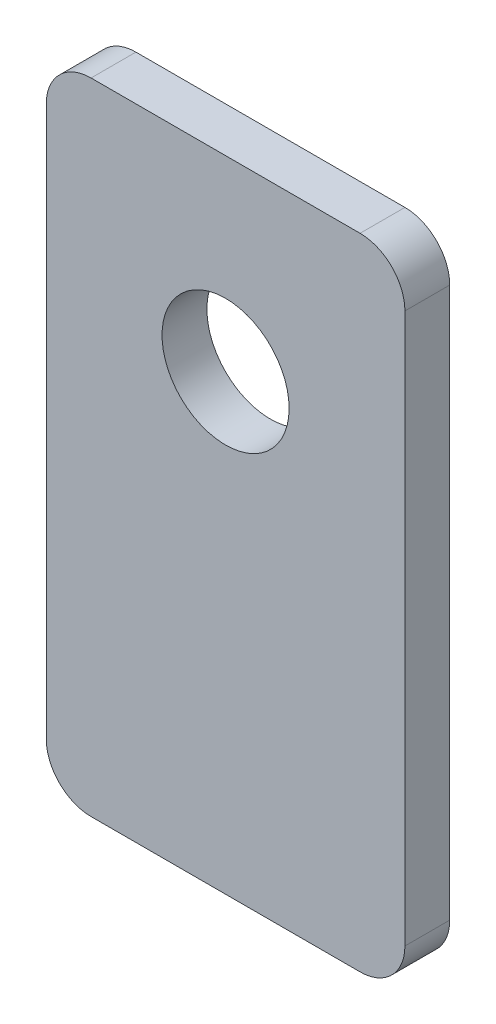
ISO-10303-21;
HEADER;
FILE_DESCRIPTION(('STEP AP214'),'2;1');
FILE_NAME('part.step','',(''),(''),'','','');
FILE_SCHEMA(('AUTOMOTIVE_DESIGN { 1 0 10303 214 1 1 1 1 }'));
ENDSEC;
DATA;
#1=APPLICATION_CONTEXT('core data for automotive mechanical design processes');
#2=APPLICATION_PROTOCOL_DEFINITION('international standard','automotive_design',2000,#1);
#3=PRODUCT_CONTEXT('',#1,'mechanical');
#4=PRODUCT('Part','Part','',(#3));
#5=PRODUCT_RELATED_PRODUCT_CATEGORY('part','',(#4));
#6=PRODUCT_DEFINITION_FORMATION('','',#4);
#7=PRODUCT_DEFINITION_CONTEXT('part definition',#1,'design');
#8=PRODUCT_DEFINITION('design','',#6,#7);
#9=PRODUCT_DEFINITION_SHAPE('','',#8);
#10=(LENGTH_UNIT() NAMED_UNIT(*) SI_UNIT(.MILLI.,.METRE.));
#11=(NAMED_UNIT(*) PLANE_ANGLE_UNIT() SI_UNIT($,.RADIAN.));
#12=(NAMED_UNIT(*) SI_UNIT($,.STERADIAN.) SOLID_ANGLE_UNIT());
#13=UNCERTAINTY_MEASURE_WITH_UNIT(LENGTH_MEASURE(1.E-05),#10,'distance_accuracy_value','');
#14=(GEOMETRIC_REPRESENTATION_CONTEXT(3) GLOBAL_UNCERTAINTY_ASSIGNED_CONTEXT((#13)) GLOBAL_UNIT_ASSIGNED_CONTEXT((#10,
#11,#12)) REPRESENTATION_CONTEXT('',''));
#15=CARTESIAN_POINT('',(0.,0.,0.));
#16=DIRECTION('',(0.,0.,1.));
#17=DIRECTION('',(1.,0.,0.));
#18=AXIS2_PLACEMENT_3D('',#15,#16,#17);
#19=CARTESIAN_POINT('',(12.7,-22.65,3.175));
#20=DIRECTION('',(-1.,0.,0.));
#21=DIRECTION('',(0.,0.,1.));
#22=AXIS2_PLACEMENT_3D('',#19,#20,#21);
#23=PLANE('',#22);
#24=DIRECTION('',(0.,1.,0.));
#25=VECTOR('',#24,1.);
#26=CARTESIAN_POINT('',(12.7,-22.65,3.175));
#27=LINE('',#26,#25);
#28=CARTESIAN_POINT('',(12.7,-19.475,3.175));
#29=VERTEX_POINT('',#28);
#30=CARTESIAN_POINT('',(12.7,19.475,3.175));
#31=VERTEX_POINT('',#30);
#32=EDGE_CURVE('E144',#29,#31,#27,.T.);
#33=ORIENTED_EDGE('',*,*,#32,.F.);
#34=DIRECTION('',(0.,0.,-1.));
#35=VECTOR('',#34,1.);
#36=CARTESIAN_POINT('',(12.7,-19.475,3.175));
#37=LINE('',#36,#35);
#38=CARTESIAN_POINT('',(12.7,-19.475,0.));
#39=VERTEX_POINT('',#38);
#40=EDGE_CURVE('E11',#29,#39,#37,.T.);
#41=ORIENTED_EDGE('',*,*,#40,.T.);
#42=DIRECTION('',(0.,1.,0.));
#43=VECTOR('',#42,1.);
#44=CARTESIAN_POINT('',(12.7,-22.65,0.));
#45=LINE('',#44,#43);
#46=CARTESIAN_POINT('',(12.7,19.475,0.));
#47=VERTEX_POINT('',#46);
#48=EDGE_CURVE('E146',#39,#47,#45,.T.);
#49=ORIENTED_EDGE('',*,*,#48,.T.);
#50=DIRECTION('',(0.,0.,-1.));
#51=VECTOR('',#50,1.);
#52=CARTESIAN_POINT('',(12.7,19.475,3.175));
#53=LINE('',#52,#51);
#54=EDGE_CURVE('E52',#47,#31,#53,.F.);
#55=ORIENTED_EDGE('',*,*,#54,.T.);
#56=EDGE_LOOP('',(#33,#41,#49,#55));
#57=FACE_BOUND('',#56,.T.);
#58=ADVANCED_FACE('F43',(#57),#23,.F.);
#59=CARTESIAN_POINT('',(-12.7,22.65,3.175));
#60=DIRECTION('',(0.,-1.,0.));
#61=DIRECTION('',(0.,0.,-1.));
#62=AXIS2_PLACEMENT_3D('',#59,#60,#61);
#63=PLANE('',#62);
#64=DIRECTION('',(-1.,0.,0.));
#65=VECTOR('',#64,1.);
#66=CARTESIAN_POINT('',(-12.7,22.65,0.));
#67=LINE('',#66,#65);
#68=CARTESIAN_POINT('',(9.525,22.65,0.));
#69=VERTEX_POINT('',#68);
#70=CARTESIAN_POINT('',(-9.525,22.65,0.));
#71=VERTEX_POINT('',#70);
#72=EDGE_CURVE('E140',#69,#71,#67,.T.);
#73=ORIENTED_EDGE('',*,*,#72,.T.);
#74=DIRECTION('',(0.,0.,-1.));
#75=VECTOR('',#74,1.);
#76=CARTESIAN_POINT('',(-9.525,22.65,3.175));
#77=LINE('',#76,#75);
#78=CARTESIAN_POINT('',(-9.525,22.65,3.175));
#79=VERTEX_POINT('',#78);
#80=EDGE_CURVE('E116',#71,#79,#77,.F.);
#81=ORIENTED_EDGE('',*,*,#80,.T.);
#82=DIRECTION('',(-1.,0.,0.));
#83=VECTOR('',#82,1.);
#84=CARTESIAN_POINT('',(-12.7,22.65,3.175));
#85=LINE('',#84,#83);
#86=CARTESIAN_POINT('',(9.525,22.65,3.175));
#87=VERTEX_POINT('',#86);
#88=EDGE_CURVE('E196',#87,#79,#85,.T.);
#89=ORIENTED_EDGE('',*,*,#88,.F.);
#90=DIRECTION('',(0.,0.,-1.));
#91=VECTOR('',#90,1.);
#92=CARTESIAN_POINT('',(9.525,22.65,3.175));
#93=LINE('',#92,#91);
#94=EDGE_CURVE('E122',#87,#69,#93,.T.);
#95=ORIENTED_EDGE('',*,*,#94,.T.);
#96=EDGE_LOOP('',(#73,#81,#89,#95));
#97=FACE_BOUND('',#96,.T.);
#98=ADVANCED_FACE('F200',(#97),#63,.F.);
#99=CARTESIAN_POINT('',(-12.7,-22.65,3.175));
#100=DIRECTION('',(1.,0.,0.));
#101=DIRECTION('',(0.,0.,-1.));
#102=AXIS2_PLACEMENT_3D('',#99,#100,#101);
#103=PLANE('',#102);
#104=DIRECTION('',(0.,-1.,0.));
#105=VECTOR('',#104,1.);
#106=CARTESIAN_POINT('',(-12.7,-22.65,3.175));
#107=LINE('',#106,#105);
#108=CARTESIAN_POINT('',(-12.7,19.475,3.175));
#109=VERTEX_POINT('',#108);
#110=CARTESIAN_POINT('',(-12.7,-19.475,3.175));
#111=VERTEX_POINT('',#110);
#112=EDGE_CURVE('E131',#109,#111,#107,.T.);
#113=ORIENTED_EDGE('',*,*,#112,.F.);
#114=DIRECTION('',(0.,0.,-1.));
#115=VECTOR('',#114,1.);
#116=CARTESIAN_POINT('',(-12.7,19.475,3.175));
#117=LINE('',#116,#115);
#118=CARTESIAN_POINT('',(-12.7,19.475,0.));
#119=VERTEX_POINT('',#118);
#120=EDGE_CURVE('E115',#109,#119,#117,.T.);
#121=ORIENTED_EDGE('',*,*,#120,.T.);
#122=DIRECTION('',(0.,-1.,0.));
#123=VECTOR('',#122,1.);
#124=CARTESIAN_POINT('',(-12.7,-22.65,0.));
#125=LINE('',#124,#123);
#126=CARTESIAN_POINT('',(-12.7,-19.475,0.));
#127=VERTEX_POINT('',#126);
#128=EDGE_CURVE('E129',#119,#127,#125,.T.);
#129=ORIENTED_EDGE('',*,*,#128,.T.);
#130=DIRECTION('',(0.,0.,-1.));
#131=VECTOR('',#130,1.);
#132=CARTESIAN_POINT('',(-12.7,-19.475,3.175));
#133=LINE('',#132,#131);
#134=EDGE_CURVE('E134',#127,#111,#133,.F.);
#135=ORIENTED_EDGE('',*,*,#134,.T.);
#136=EDGE_LOOP('',(#113,#121,#129,#135));
#137=FACE_BOUND('',#136,.T.);
#138=ADVANCED_FACE('F128',(#137),#103,.F.);
#139=CARTESIAN_POINT('',(-12.7,-22.65,3.175));
#140=DIRECTION('',(0.,1.,0.));
#141=DIRECTION('',(0.,0.,1.));
#142=AXIS2_PLACEMENT_3D('',#139,#140,#141);
#143=PLANE('',#142);
#144=DIRECTION('',(1.,0.,0.));
#145=VECTOR('',#144,1.);
#146=CARTESIAN_POINT('',(-12.7,-22.65,3.175));
#147=LINE('',#146,#145);
#148=CARTESIAN_POINT('',(-9.525,-22.65,3.175));
#149=VERTEX_POINT('',#148);
#150=CARTESIAN_POINT('',(9.525,-22.65,3.175));
#151=VERTEX_POINT('',#150);
#152=EDGE_CURVE('E151',#149,#151,#147,.T.);
#153=ORIENTED_EDGE('',*,*,#152,.F.);
#154=DIRECTION('',(0.,0.,-1.));
#155=VECTOR('',#154,1.);
#156=CARTESIAN_POINT('',(-9.525,-22.65,3.175));
#157=LINE('',#156,#155);
#158=CARTESIAN_POINT('',(-9.525,-22.65,0.));
#159=VERTEX_POINT('',#158);
#160=EDGE_CURVE('E178',#149,#159,#157,.T.);
#161=ORIENTED_EDGE('',*,*,#160,.T.);
#162=DIRECTION('',(1.,0.,0.));
#163=VECTOR('',#162,1.);
#164=CARTESIAN_POINT('',(-12.7,-22.65,0.));
#165=LINE('',#164,#163);
#166=CARTESIAN_POINT('',(9.525,-22.65,0.));
#167=VERTEX_POINT('',#166);
#168=EDGE_CURVE('E139',#159,#167,#165,.T.);
#169=ORIENTED_EDGE('',*,*,#168,.T.);
#170=DIRECTION('',(0.,0.,-1.));
#171=VECTOR('',#170,1.);
#172=CARTESIAN_POINT('',(9.525,-22.65,3.175));
#173=LINE('',#172,#171);
#174=EDGE_CURVE('E59',#167,#151,#173,.F.);
#175=ORIENTED_EDGE('',*,*,#174,.T.);
#176=EDGE_LOOP('',(#153,#161,#169,#175));
#177=FACE_BOUND('',#176,.T.);
#178=ADVANCED_FACE('F221',(#177),#143,.F.);
#179=CARTESIAN_POINT('',(0.,0.,3.175));
#180=DIRECTION('',(0.,0.,-1.));
#181=DIRECTION('',(-1.,0.,0.));
#182=AXIS2_PLACEMENT_3D('',#179,#180,#181);
#183=PLANE('',#182);
#184=CARTESIAN_POINT('',(0.,9.40000000000001,3.175));
#185=DIRECTION('',(0.,0.,1.));
#186=DIRECTION('',(1.,0.,0.));
#187=AXIS2_PLACEMENT_3D('',#184,#185,#186);
#188=CIRCLE('',#187,4.5);
#189=CARTESIAN_POINT('',(4.5,9.40000000000001,3.175));
#190=VERTEX_POINT('',#189);
#191=EDGE_CURVE('E205',#190,#190,#188,.T.);
#192=ORIENTED_EDGE('',*,*,#191,.F.);
#193=EDGE_LOOP('',(#192));
#194=FACE_BOUND('',#193,.T.);
#195=ORIENTED_EDGE('',*,*,#88,.T.);
#196=CARTESIAN_POINT('',(-9.525,19.475,3.175));
#197=DIRECTION('',(0.,0.,-1.));
#198=DIRECTION('',(-1.,0.,0.));
#199=AXIS2_PLACEMENT_3D('',#196,#197,#198);
#200=CIRCLE('',#199,3.175);
#201=EDGE_CURVE('E173',#79,#109,#200,.F.);
#202=ORIENTED_EDGE('',*,*,#201,.T.);
#203=ORIENTED_EDGE('',*,*,#112,.T.);
#204=CARTESIAN_POINT('',(-9.525,-19.475,3.175));
#205=DIRECTION('',(0.,0.,-1.));
#206=DIRECTION('',(-1.,0.,0.));
#207=AXIS2_PLACEMENT_3D('',#204,#205,#206);
#208=CIRCLE('',#207,3.175);
#209=EDGE_CURVE('E66',#111,#149,#208,.F.);
#210=ORIENTED_EDGE('',*,*,#209,.T.);
#211=ORIENTED_EDGE('',*,*,#152,.T.);
#212=CARTESIAN_POINT('',(9.525,-19.475,3.175));
#213=DIRECTION('',(0.,0.,-1.));
#214=DIRECTION('',(-1.,0.,0.));
#215=AXIS2_PLACEMENT_3D('',#212,#213,#214);
#216=CIRCLE('',#215,3.175);
#217=EDGE_CURVE('E168',#151,#29,#216,.F.);
#218=ORIENTED_EDGE('',*,*,#217,.T.);
#219=ORIENTED_EDGE('',*,*,#32,.T.);
#220=CARTESIAN_POINT('',(9.525,19.475,3.175));
#221=DIRECTION('',(0.,0.,-1.));
#222=DIRECTION('',(-1.,0.,0.));
#223=AXIS2_PLACEMENT_3D('',#220,#221,#222);
#224=CIRCLE('',#223,3.175);
#225=EDGE_CURVE('E165',#31,#87,#224,.F.);
#226=ORIENTED_EDGE('',*,*,#225,.T.);
#227=EDGE_LOOP('',(#195,#202,#203,#210,#211,#218,#219,#226));
#228=FACE_BOUND('',#227,.T.);
#229=ADVANCED_FACE('F192',(#194,#228),#183,.F.);
#230=CARTESIAN_POINT('',(0.,0.,0.));
#231=DIRECTION('',(0.,0.,-1.));
#232=DIRECTION('',(-1.,0.,0.));
#233=AXIS2_PLACEMENT_3D('',#230,#231,#232);
#234=PLANE('',#233);
#235=CARTESIAN_POINT('',(0.,9.40000000000001,0.));
#236=DIRECTION('',(0.,0.,1.));
#237=DIRECTION('',(1.,0.,0.));
#238=AXIS2_PLACEMENT_3D('',#235,#236,#237);
#239=CIRCLE('',#238,4.5);
#240=CARTESIAN_POINT('',(4.5,9.40000000000001,0.));
#241=VERTEX_POINT('',#240);
#242=EDGE_CURVE('E202',#241,#241,#239,.T.);
#243=ORIENTED_EDGE('',*,*,#242,.T.);
#244=EDGE_LOOP('',(#243));
#245=FACE_BOUND('',#244,.T.);
#246=ORIENTED_EDGE('',*,*,#128,.F.);
#247=CARTESIAN_POINT('',(-9.525,19.475,0.));
#248=DIRECTION('',(0.,0.,-1.));
#249=DIRECTION('',(-1.,0.,0.));
#250=AXIS2_PLACEMENT_3D('',#247,#248,#249);
#251=CIRCLE('',#250,3.175);
#252=EDGE_CURVE('E111',#119,#71,#251,.T.);
#253=ORIENTED_EDGE('',*,*,#252,.T.);
#254=ORIENTED_EDGE('',*,*,#72,.F.);
#255=CARTESIAN_POINT('',(9.525,19.475,0.));
#256=DIRECTION('',(0.,0.,-1.));
#257=DIRECTION('',(-1.,0.,0.));
#258=AXIS2_PLACEMENT_3D('',#255,#256,#257);
#259=CIRCLE('',#258,3.175);
#260=EDGE_CURVE('E133',#69,#47,#259,.T.);
#261=ORIENTED_EDGE('',*,*,#260,.T.);
#262=ORIENTED_EDGE('',*,*,#48,.F.);
#263=CARTESIAN_POINT('',(9.525,-19.475,0.));
#264=DIRECTION('',(0.,0.,-1.));
#265=DIRECTION('',(-1.,0.,0.));
#266=AXIS2_PLACEMENT_3D('',#263,#264,#265);
#267=CIRCLE('',#266,3.175);
#268=EDGE_CURVE('E155',#39,#167,#267,.T.);
#269=ORIENTED_EDGE('',*,*,#268,.T.);
#270=ORIENTED_EDGE('',*,*,#168,.F.);
#271=CARTESIAN_POINT('',(-9.525,-19.475,0.));
#272=DIRECTION('',(0.,0.,-1.));
#273=DIRECTION('',(-1.,0.,0.));
#274=AXIS2_PLACEMENT_3D('',#271,#272,#273);
#275=CIRCLE('',#274,3.175);
#276=EDGE_CURVE('E123',#159,#127,#275,.T.);
#277=ORIENTED_EDGE('',*,*,#276,.T.);
#278=EDGE_LOOP('',(#246,#253,#254,#261,#262,#269,#270,#277));
#279=FACE_BOUND('',#278,.T.);
#280=ADVANCED_FACE('F136',(#245,#279),#234,.T.);
#281=CARTESIAN_POINT('',(0.,9.40000000000001,0.));
#282=DIRECTION('',(0.,0.,1.));
#283=DIRECTION('',(1.,0.,0.));
#284=AXIS2_PLACEMENT_3D('',#281,#282,#283);
#285=CYLINDRICAL_SURFACE('',#284,4.5);
#286=ORIENTED_EDGE('',*,*,#242,.F.);
#287=EDGE_LOOP('',(#286));
#288=FACE_BOUND('',#287,.T.);
#289=ORIENTED_EDGE('',*,*,#191,.T.);
#290=EDGE_LOOP('',(#289));
#291=FACE_BOUND('',#290,.T.);
#292=ADVANCED_FACE('F218',(#288,#291),#285,.F.);
#293=CARTESIAN_POINT('',(-9.525,19.475,3.175));
#294=DIRECTION('',(0.,0.,-1.));
#295=DIRECTION('',(-1.,0.,0.));
#296=AXIS2_PLACEMENT_3D('',#293,#294,#295);
#297=CYLINDRICAL_SURFACE('',#296,3.175);
#298=ORIENTED_EDGE('',*,*,#201,.F.);
#299=ORIENTED_EDGE('',*,*,#80,.F.);
#300=ORIENTED_EDGE('',*,*,#252,.F.);
#301=ORIENTED_EDGE('',*,*,#120,.F.);
#302=EDGE_LOOP('',(#298,#299,#300,#301));
#303=FACE_BOUND('',#302,.T.);
#304=ADVANCED_FACE('F114',(#303),#297,.T.);
#305=CARTESIAN_POINT('',(-9.525,-19.475,3.175));
#306=DIRECTION('',(0.,0.,-1.));
#307=DIRECTION('',(-1.,0.,0.));
#308=AXIS2_PLACEMENT_3D('',#305,#306,#307);
#309=CYLINDRICAL_SURFACE('',#308,3.175);
#310=ORIENTED_EDGE('',*,*,#209,.F.);
#311=ORIENTED_EDGE('',*,*,#134,.F.);
#312=ORIENTED_EDGE('',*,*,#276,.F.);
#313=ORIENTED_EDGE('',*,*,#160,.F.);
#314=EDGE_LOOP('',(#310,#311,#312,#313));
#315=FACE_BOUND('',#314,.T.);
#316=ADVANCED_FACE('F241',(#315),#309,.T.);
#317=CARTESIAN_POINT('',(9.525,-19.475,3.175));
#318=DIRECTION('',(0.,0.,-1.));
#319=DIRECTION('',(-1.,0.,0.));
#320=AXIS2_PLACEMENT_3D('',#317,#318,#319);
#321=CYLINDRICAL_SURFACE('',#320,3.175);
#322=ORIENTED_EDGE('',*,*,#217,.F.);
#323=ORIENTED_EDGE('',*,*,#174,.F.);
#324=ORIENTED_EDGE('',*,*,#268,.F.);
#325=ORIENTED_EDGE('',*,*,#40,.F.);
#326=EDGE_LOOP('',(#322,#323,#324,#325));
#327=FACE_BOUND('',#326,.T.);
#328=ADVANCED_FACE('F243',(#327),#321,.T.);
#329=CARTESIAN_POINT('',(9.525,19.475,3.175));
#330=DIRECTION('',(0.,0.,-1.));
#331=DIRECTION('',(-1.,0.,0.));
#332=AXIS2_PLACEMENT_3D('',#329,#330,#331);
#333=CYLINDRICAL_SURFACE('',#332,3.175);
#334=ORIENTED_EDGE('',*,*,#225,.F.);
#335=ORIENTED_EDGE('',*,*,#54,.F.);
#336=ORIENTED_EDGE('',*,*,#260,.F.);
#337=ORIENTED_EDGE('',*,*,#94,.F.);
#338=EDGE_LOOP('',(#334,#335,#336,#337));
#339=FACE_BOUND('',#338,.T.);
#340=ADVANCED_FACE('F45',(#339),#333,.T.);
#341=CLOSED_SHELL('',(#58,#98,#138,#178,#229,#280,#292,#304,#316,#328,#340));
#342=MANIFOLD_SOLID_BREP('B2',#341);
#343=ADVANCED_BREP_SHAPE_REPRESENTATION('',(#18,#342),#14);
#344=SHAPE_DEFINITION_REPRESENTATION(#9,#343);
ENDSEC;
END-ISO-10303-21;
